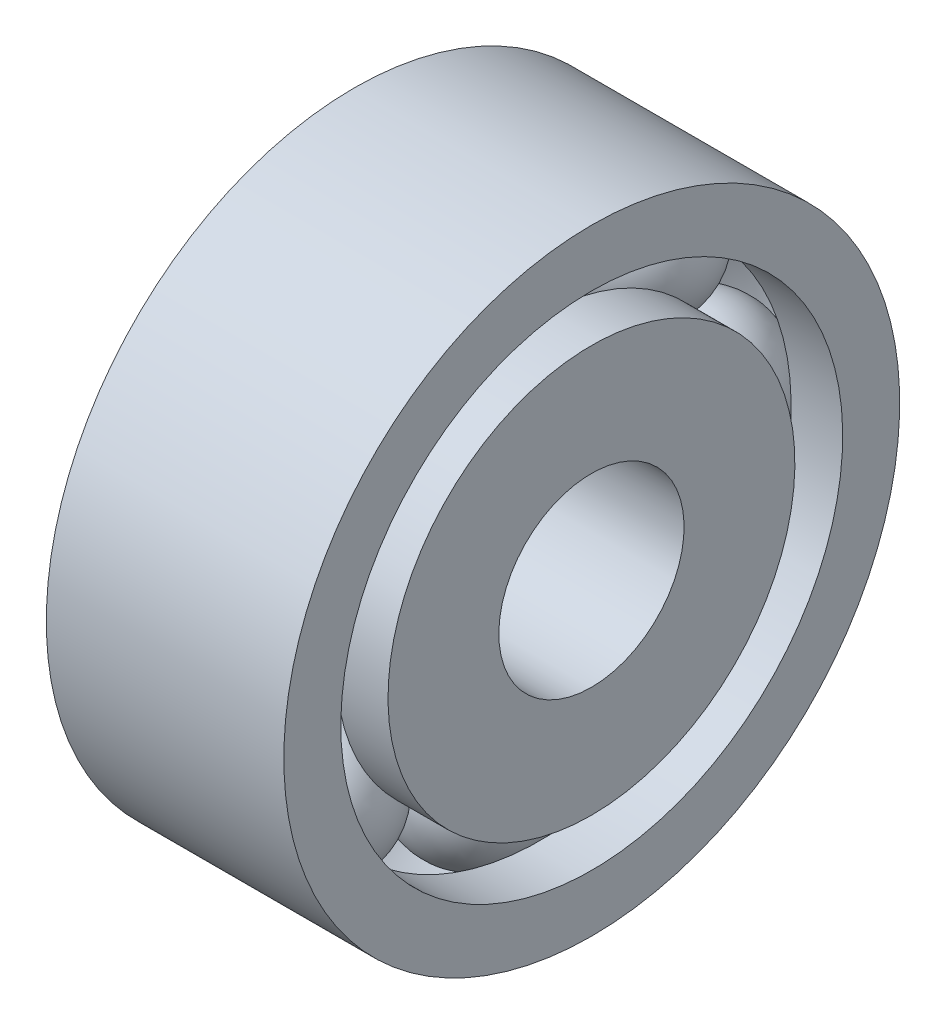
ISO-10303-21;
HEADER;
FILE_DESCRIPTION(('STEP AP214'),'2;1');
FILE_NAME('part.step','',(''),(''),'','','');
FILE_SCHEMA(('AUTOMOTIVE_DESIGN { 1 0 10303 214 1 1 1 1 }'));
ENDSEC;
DATA;
#1=APPLICATION_CONTEXT('core data for automotive mechanical design processes');
#2=APPLICATION_PROTOCOL_DEFINITION('international standard','automotive_design',2000,#1);
#3=PRODUCT_CONTEXT('',#1,'mechanical');
#4=PRODUCT('Part','Part','',(#3));
#5=PRODUCT_RELATED_PRODUCT_CATEGORY('part','',(#4));
#6=PRODUCT_DEFINITION_FORMATION('','',#4);
#7=PRODUCT_DEFINITION_CONTEXT('part definition',#1,'design');
#8=PRODUCT_DEFINITION('design','',#6,#7);
#9=PRODUCT_DEFINITION_SHAPE('','',#8);
#10=(LENGTH_UNIT() NAMED_UNIT(*) SI_UNIT(.MILLI.,.METRE.));
#11=(NAMED_UNIT(*) PLANE_ANGLE_UNIT() SI_UNIT($,.RADIAN.));
#12=(NAMED_UNIT(*) SI_UNIT($,.STERADIAN.) SOLID_ANGLE_UNIT());
#13=UNCERTAINTY_MEASURE_WITH_UNIT(LENGTH_MEASURE(1.E-05),#10,'distance_accuracy_value','');
#14=(GEOMETRIC_REPRESENTATION_CONTEXT(3) GLOBAL_UNCERTAINTY_ASSIGNED_CONTEXT((#13)) GLOBAL_UNIT_ASSIGNED_CONTEXT((#10,
#11,#12)) REPRESENTATION_CONTEXT('',''));
#15=CARTESIAN_POINT('',(0.,0.,0.));
#16=DIRECTION('',(0.,0.,1.));
#17=DIRECTION('',(1.,0.,0.));
#18=AXIS2_PLACEMENT_3D('',#15,#16,#17);
#19=CARTESIAN_POINT('',(0.,8.59029496479624,8.59029496479603));
#20=DIRECTION('',(0.,-0.707106781186556,-0.707106781186539));
#21=DIRECTION('',(-1.,0.,0.));
#22=AXIS2_PLACEMENT_3D('',#19,#20,#21);
#23=SPHERICAL_SURFACE('',#22,3.7465);
#24=CARTESIAN_POINT('',(0.,5.94111940908081,5.94111940908066));
#25=VERTEX_POINT('',#24);
#26=VERTEX_LOOP('',#25);
#27=FACE_BOUND('',#26,.T.);
#28=ADVANCED_FACE('F52',(#27),#23,.T.);
#29=CLOSED_SHELL('',(#28));
#30=MANIFOLD_SOLID_BREP('B2',#29);
#31=CARTESIAN_POINT('',(0.,1.27248905099234E-13,12.148511644));
#32=DIRECTION('',(0.,0.,-1.));
#33=DIRECTION('',(-1.,0.,0.));
#34=AXIS2_PLACEMENT_3D('',#31,#32,#33);
#35=SPHERICAL_SURFACE('',#34,3.7465);
#36=CARTESIAN_POINT('',(0.,0.,8.402011644));
#37=VERTEX_POINT('',#36);
#38=VERTEX_LOOP('',#37);
#39=FACE_BOUND('',#38,.T.);
#40=ADVANCED_FACE('F71',(#39),#35,.T.);
#41=CLOSED_SHELL('',(#40));
#42=MANIFOLD_SOLID_BREP('B6',#41);
#43=CARTESIAN_POINT('',(0.,-8.59029496479606,8.59029496479621));
#44=DIRECTION('',(0.,0.707106781186541,-0.707106781186554));
#45=DIRECTION('',(-1.,0.,0.));
#46=AXIS2_PLACEMENT_3D('',#43,#44,#45);
#47=SPHERICAL_SURFACE('',#46,3.7465);
#48=CARTESIAN_POINT('',(0.,-5.94111940908068,5.94111940908078));
#49=VERTEX_POINT('',#48);
#50=VERTEX_LOOP('',#49);
#51=FACE_BOUND('',#50,.T.);
#52=ADVANCED_FACE('F90',(#51),#47,.T.);
#53=CLOSED_SHELL('',(#52));
#54=MANIFOLD_SOLID_BREP('B48',#53);
#55=CARTESIAN_POINT('',(0.,-12.148511644,0.));
#56=DIRECTION('',(0.,1.,0.));
#57=DIRECTION('',(-1.,0.,0.));
#58=AXIS2_PLACEMENT_3D('',#55,#56,#57);
#59=SPHERICAL_SURFACE('',#58,3.7465);
#60=CARTESIAN_POINT('',(0.,-8.402011644,0.));
#61=VERTEX_POINT('',#60);
#62=VERTEX_LOOP('',#61);
#63=FACE_BOUND('',#62,.T.);
#64=ADVANCED_FACE('F109',(#63),#59,.T.);
#65=CLOSED_SHELL('',(#64));
#66=MANIFOLD_SOLID_BREP('B67',#65);
#67=CARTESIAN_POINT('',(0.,-8.59029496479618,-8.59029496479609));
#68=DIRECTION('',(0.,0.707106781186551,0.707106781186544));
#69=DIRECTION('',(-1.,0.,0.));
#70=AXIS2_PLACEMENT_3D('',#67,#68,#69);
#71=SPHERICAL_SURFACE('',#70,3.7465);
#72=CARTESIAN_POINT('',(0.,-5.94111940908076,-5.9411194090807));
#73=VERTEX_POINT('',#72);
#74=VERTEX_LOOP('',#73);
#75=FACE_BOUND('',#74,.T.);
#76=ADVANCED_FACE('F128',(#75),#71,.T.);
#77=CLOSED_SHELL('',(#76));
#78=MANIFOLD_SOLID_BREP('B86',#77);
#79=CARTESIAN_POINT('',(0.,0.,-12.148511644));
#80=DIRECTION('',(0.,0.,1.));
#81=DIRECTION('',(-1.,0.,0.));
#82=AXIS2_PLACEMENT_3D('',#79,#80,#81);
#83=SPHERICAL_SURFACE('',#82,3.7465);
#84=CARTESIAN_POINT('',(0.,0.,-8.402011644));
#85=VERTEX_POINT('',#84);
#86=VERTEX_LOOP('',#85);
#87=FACE_BOUND('',#86,.T.);
#88=ADVANCED_FACE('F147',(#87),#83,.T.);
#89=CLOSED_SHELL('',(#88));
#90=MANIFOLD_SOLID_BREP('B105',#89);
#91=CARTESIAN_POINT('',(0.,8.59029496479612,-8.59029496479615));
#92=DIRECTION('',(0.,-0.707106781186546,0.707106781186549));
#93=DIRECTION('',(-1.,0.,0.));
#94=AXIS2_PLACEMENT_3D('',#91,#92,#93);
#95=SPHERICAL_SURFACE('',#94,3.7465);
#96=CARTESIAN_POINT('',(0.,5.94111940908072,-5.94111940908074));
#97=VERTEX_POINT('',#96);
#98=VERTEX_LOOP('',#97);
#99=FACE_BOUND('',#98,.T.);
#100=ADVANCED_FACE('F166',(#99),#95,.T.);
#101=CLOSED_SHELL('',(#100));
#102=MANIFOLD_SOLID_BREP('B124',#101);
#103=CARTESIAN_POINT('',(0.,12.148511644,0.));
#104=DIRECTION('',(0.,-1.,0.));
#105=DIRECTION('',(-1.,0.,0.));
#106=AXIS2_PLACEMENT_3D('',#103,#104,#105);
#107=SPHERICAL_SURFACE('',#106,3.7465);
#108=CARTESIAN_POINT('',(0.,8.402011644,0.));
#109=VERTEX_POINT('',#108);
#110=VERTEX_LOOP('',#109);
#111=FACE_BOUND('',#110,.T.);
#112=ADVANCED_FACE('F187',(#111),#107,.T.);
#113=CLOSED_SHELL('',(#112));
#114=MANIFOLD_SOLID_BREP('B143',#113);
#115=CARTESIAN_POINT('',(0.,0.,0.));
#116=DIRECTION('',(-1.,0.,0.));
#117=DIRECTION('',(0.,-1.,0.));
#118=AXIS2_PLACEMENT_3D('',#115,#116,#117);
#119=TOROIDAL_SURFACE('',#118,12.148511644,3.81);
#120=CARTESIAN_POINT('',(3.59210244842766,0.,0.));
#121=DIRECTION('',(-1.,0.,0.));
#122=DIRECTION('',(0.,-1.,0.));
#123=AXIS2_PLACEMENT_3D('',#120,#121,#122);
#124=CIRCLE('',#123,10.878511644);
#125=CARTESIAN_POINT('',(3.59210244842767,-10.878511644,0.));
#126=VERTEX_POINT('',#125);
#127=EDGE_CURVE('E234',#126,#126,#124,.T.);
#128=ORIENTED_EDGE('',*,*,#127,.T.);
#129=EDGE_LOOP('',(#128));
#130=FACE_BOUND('',#129,.T.);
#131=CARTESIAN_POINT('',(-3.59210244842766,0.,0.));
#132=DIRECTION('',(-1.,0.,0.));
#133=DIRECTION('',(0.,-1.,0.));
#134=AXIS2_PLACEMENT_3D('',#131,#132,#133);
#135=CIRCLE('',#134,10.878511644);
#136=CARTESIAN_POINT('',(-3.59210244842765,-10.878511644,0.));
#137=VERTEX_POINT('',#136);
#138=EDGE_CURVE('E186',#137,#137,#135,.T.);
#139=ORIENTED_EDGE('',*,*,#138,.F.);
#140=EDGE_LOOP('',(#139));
#141=FACE_BOUND('',#140,.T.);
#142=ADVANCED_FACE('F207',(#130,#141),#119,.F.);
#143=CARTESIAN_POINT('',(6.35,0.,0.));
#144=DIRECTION('',(-1.,0.,0.));
#145=DIRECTION('',(0.,-1.,0.));
#146=AXIS2_PLACEMENT_3D('',#143,#144,#145);
#147=CYLINDRICAL_SURFACE('',#146,10.878511644);
#148=ORIENTED_EDGE('',*,*,#138,.T.);
#149=EDGE_LOOP('',(#148));
#150=FACE_BOUND('',#149,.T.);
#151=CARTESIAN_POINT('',(-6.35,0.,0.));
#152=DIRECTION('',(-1.,0.,0.));
#153=DIRECTION('',(0.,-1.,0.));
#154=AXIS2_PLACEMENT_3D('',#151,#152,#153);
#155=CIRCLE('',#154,10.878511644);
#156=CARTESIAN_POINT('',(-6.34999999999999,-10.878511644,0.));
#157=VERTEX_POINT('',#156);
#158=EDGE_CURVE('E214',#157,#157,#155,.T.);
#159=ORIENTED_EDGE('',*,*,#158,.F.);
#160=EDGE_LOOP('',(#159));
#161=FACE_BOUND('',#160,.T.);
#162=ADVANCED_FACE('F246',(#150,#161),#147,.T.);
#163=CARTESIAN_POINT('',(-6.35,0.,0.));
#164=DIRECTION('',(-1.,0.,0.));
#165=DIRECTION('',(0.,-1.,0.));
#166=AXIS2_PLACEMENT_3D('',#163,#164,#165);
#167=PLANE('',#166);
#168=ORIENTED_EDGE('',*,*,#158,.T.);
#169=EDGE_LOOP('',(#168));
#170=FACE_BOUND('',#169,.T.);
#171=CARTESIAN_POINT('',(-6.35,0.,0.));
#172=DIRECTION('',(-1.,0.,0.));
#173=DIRECTION('',(0.,-1.,0.));
#174=AXIS2_PLACEMENT_3D('',#171,#172,#173);
#175=CIRCLE('',#174,4.953);
#176=CARTESIAN_POINT('',(-6.35,-4.953,0.));
#177=VERTEX_POINT('',#176);
#178=EDGE_CURVE('E219',#177,#177,#175,.T.);
#179=ORIENTED_EDGE('',*,*,#178,.F.);
#180=EDGE_LOOP('',(#179));
#181=FACE_BOUND('',#180,.T.);
#182=ADVANCED_FACE('F254',(#170,#181),#167,.T.);
#183=CARTESIAN_POINT('',(6.35,0.,0.));
#184=DIRECTION('',(-1.,0.,0.));
#185=DIRECTION('',(0.,-1.,0.));
#186=AXIS2_PLACEMENT_3D('',#183,#184,#185);
#187=CYLINDRICAL_SURFACE('',#186,4.953);
#188=CARTESIAN_POINT('',(6.35,0.,0.));
#189=DIRECTION('',(-1.,0.,0.));
#190=DIRECTION('',(0.,-1.,0.));
#191=AXIS2_PLACEMENT_3D('',#188,#189,#190);
#192=CIRCLE('',#191,4.953);
#193=CARTESIAN_POINT('',(6.35,-4.95299999999999,0.));
#194=VERTEX_POINT('',#193);
#195=EDGE_CURVE('E224',#194,#194,#192,.T.);
#196=ORIENTED_EDGE('',*,*,#195,.F.);
#197=EDGE_LOOP('',(#196));
#198=FACE_BOUND('',#197,.T.);
#199=ORIENTED_EDGE('',*,*,#178,.T.);
#200=EDGE_LOOP('',(#199));
#201=FACE_BOUND('',#200,.T.);
#202=ADVANCED_FACE('F250',(#198,#201),#187,.F.);
#203=CARTESIAN_POINT('',(6.35,0.,0.));
#204=DIRECTION('',(1.,0.,0.));
#205=DIRECTION('',(0.,1.,0.));
#206=AXIS2_PLACEMENT_3D('',#203,#204,#205);
#207=PLANE('',#206);
#208=ORIENTED_EDGE('',*,*,#195,.T.);
#209=EDGE_LOOP('',(#208));
#210=FACE_BOUND('',#209,.T.);
#211=CARTESIAN_POINT('',(6.35,0.,0.));
#212=DIRECTION('',(-1.,0.,0.));
#213=DIRECTION('',(0.,-1.,0.));
#214=AXIS2_PLACEMENT_3D('',#211,#212,#213);
#215=CIRCLE('',#214,10.878511644);
#216=CARTESIAN_POINT('',(6.35000000000001,-10.878511644,0.));
#217=VERTEX_POINT('',#216);
#218=EDGE_CURVE('E230',#217,#217,#215,.T.);
#219=ORIENTED_EDGE('',*,*,#218,.F.);
#220=EDGE_LOOP('',(#219));
#221=FACE_BOUND('',#220,.T.);
#222=ADVANCED_FACE('F243',(#210,#221),#207,.T.);
#223=ORIENTED_EDGE('',*,*,#218,.T.);
#224=EDGE_LOOP('',(#223));
#225=FACE_BOUND('',#224,.T.);
#226=ORIENTED_EDGE('',*,*,#127,.F.);
#227=EDGE_LOOP('',(#226));
#228=FACE_BOUND('',#227,.T.);
#229=ADVANCED_FACE('F241',(#225,#228),#147,.T.);
#230=CLOSED_SHELL('',(#142,#162,#182,#202,#222,#229));
#231=MANIFOLD_SOLID_BREP('B162',#230);
#232=CARTESIAN_POINT('',(0.0162412053396235,0.,0.));
#233=DIRECTION('',(1.,0.,0.));
#234=DIRECTION('',(0.,1.,0.));
#235=AXIS2_PLACEMENT_3D('',#232,#233,#234);
#236=TOROIDAL_SURFACE('',#235,12.1485117507252,3.81);
#237=CARTESIAN_POINT('',(-3.57586124308804,0.,0.));
#238=DIRECTION('',(1.,0.,0.));
#239=DIRECTION('',(0.,1.,0.));
#240=AXIS2_PLACEMENT_3D('',#237,#238,#239);
#241=CIRCLE('',#240,13.4185117507252);
#242=CARTESIAN_POINT('',(-3.57586124308804,13.4185117507252,0.));
#243=VERTEX_POINT('',#242);
#244=EDGE_CURVE('E332',#243,#243,#241,.T.);
#245=ORIENTED_EDGE('',*,*,#244,.F.);
#246=EDGE_LOOP('',(#245));
#247=FACE_BOUND('',#246,.T.);
#248=CARTESIAN_POINT('',(3.60834365376729,0.,0.));
#249=DIRECTION('',(1.,0.,0.));
#250=DIRECTION('',(0.,1.,0.));
#251=AXIS2_PLACEMENT_3D('',#248,#249,#250);
#252=CIRCLE('',#251,13.4185117507252);
#253=CARTESIAN_POINT('',(3.60834365376729,13.4185117507252,0.));
#254=VERTEX_POINT('',#253);
#255=EDGE_CURVE('E206',#254,#254,#252,.T.);
#256=ORIENTED_EDGE('',*,*,#255,.T.);
#257=EDGE_LOOP('',(#256));
#258=FACE_BOUND('',#257,.T.);
#259=ADVANCED_FACE('F310',(#247,#258),#236,.F.);
#260=CARTESIAN_POINT('',(-6.33375879466038,0.,0.));
#261=DIRECTION('',(1.,0.,0.));
#262=DIRECTION('',(0.,1.,0.));
#263=AXIS2_PLACEMENT_3D('',#260,#261,#262);
#264=CYLINDRICAL_SURFACE('',#263,13.4185117507252);
#265=CARTESIAN_POINT('',(6.36624120533962,0.,0.));
#266=DIRECTION('',(1.,0.,0.));
#267=DIRECTION('',(0.,1.,0.));
#268=AXIS2_PLACEMENT_3D('',#265,#266,#267);
#269=CIRCLE('',#268,13.4185117507252);
#270=CARTESIAN_POINT('',(6.36624120533962,13.4185117507252,0.));
#271=VERTEX_POINT('',#270);
#272=EDGE_CURVE('E316',#271,#271,#269,.T.);
#273=ORIENTED_EDGE('',*,*,#272,.T.);
#274=EDGE_LOOP('',(#273));
#275=FACE_BOUND('',#274,.T.);
#276=ORIENTED_EDGE('',*,*,#255,.F.);
#277=EDGE_LOOP('',(#276));
#278=FACE_BOUND('',#277,.T.);
#279=ADVANCED_FACE('F340',(#275,#278),#264,.F.);
#280=CARTESIAN_POINT('',(6.36624120533962,0.,0.));
#281=DIRECTION('',(-1.,0.,0.));
#282=DIRECTION('',(0.,-1.,0.));
#283=AXIS2_PLACEMENT_3D('',#280,#281,#282);
#284=PLANE('',#283);
#285=ORIENTED_EDGE('',*,*,#272,.F.);
#286=EDGE_LOOP('',(#285));
#287=FACE_BOUND('',#286,.T.);
#288=CARTESIAN_POINT('',(6.36624120533962,0.,0.));
#289=DIRECTION('',(1.,0.,0.));
#290=DIRECTION('',(0.,1.,0.));
#291=AXIS2_PLACEMENT_3D('',#288,#289,#290);
#292=CIRCLE('',#291,16.4665117507252);
#293=CARTESIAN_POINT('',(6.36624120533962,16.4665117507252,0.));
#294=VERTEX_POINT('',#293);
#295=EDGE_CURVE('E320',#294,#294,#292,.T.);
#296=ORIENTED_EDGE('',*,*,#295,.T.);
#297=EDGE_LOOP('',(#296));
#298=FACE_BOUND('',#297,.T.);
#299=ADVANCED_FACE('F344',(#287,#298),#284,.F.);
#300=CARTESIAN_POINT('',(-6.33375879466038,0.,0.));
#301=DIRECTION('',(1.,0.,0.));
#302=DIRECTION('',(0.,1.,0.));
#303=AXIS2_PLACEMENT_3D('',#300,#301,#302);
#304=CYLINDRICAL_SURFACE('',#303,16.4665117507252);
#305=ORIENTED_EDGE('',*,*,#295,.F.);
#306=EDGE_LOOP('',(#305));
#307=FACE_BOUND('',#306,.T.);
#308=CARTESIAN_POINT('',(-6.33375879466038,0.,0.));
#309=DIRECTION('',(1.,0.,0.));
#310=DIRECTION('',(0.,1.,0.));
#311=AXIS2_PLACEMENT_3D('',#308,#309,#310);
#312=CIRCLE('',#311,16.4665117507252);
#313=CARTESIAN_POINT('',(-6.33375879466038,16.4665117507252,0.));
#314=VERTEX_POINT('',#313);
#315=EDGE_CURVE('E324',#314,#314,#312,.T.);
#316=ORIENTED_EDGE('',*,*,#315,.T.);
#317=EDGE_LOOP('',(#316));
#318=FACE_BOUND('',#317,.T.);
#319=ADVANCED_FACE('F349',(#307,#318),#304,.T.);
#320=CARTESIAN_POINT('',(-6.33375879466038,0.,0.));
#321=DIRECTION('',(1.,0.,0.));
#322=DIRECTION('',(0.,1.,0.));
#323=AXIS2_PLACEMENT_3D('',#320,#321,#322);
#324=PLANE('',#323);
#325=ORIENTED_EDGE('',*,*,#315,.F.);
#326=EDGE_LOOP('',(#325));
#327=FACE_BOUND('',#326,.T.);
#328=CARTESIAN_POINT('',(-6.33375879466038,0.,0.));
#329=DIRECTION('',(1.,0.,0.));
#330=DIRECTION('',(0.,1.,0.));
#331=AXIS2_PLACEMENT_3D('',#328,#329,#330);
#332=CIRCLE('',#331,13.4185117507252);
#333=CARTESIAN_POINT('',(-6.33375879466038,13.4185117507252,0.));
#334=VERTEX_POINT('',#333);
#335=EDGE_CURVE('E329',#334,#334,#332,.T.);
#336=ORIENTED_EDGE('',*,*,#335,.T.);
#337=EDGE_LOOP('',(#336));
#338=FACE_BOUND('',#337,.T.);
#339=ADVANCED_FACE('F354',(#327,#338),#324,.F.);
#340=ORIENTED_EDGE('',*,*,#244,.T.);
#341=EDGE_LOOP('',(#340));
#342=FACE_BOUND('',#341,.T.);
#343=ORIENTED_EDGE('',*,*,#335,.F.);
#344=EDGE_LOOP('',(#343));
#345=FACE_BOUND('',#344,.T.);
#346=ADVANCED_FACE('F336',(#342,#345),#264,.F.);
#347=CLOSED_SHELL('',(#259,#279,#299,#319,#339,#346));
#348=MANIFOLD_SOLID_BREP('B181',#347);
#349=ADVANCED_BREP_SHAPE_REPRESENTATION('',(#18,#30,#42,#54,#66,#78,#90,#102,#114,#231,#348),#14);
#350=SHAPE_DEFINITION_REPRESENTATION(#9,#349);
ENDSEC;
END-ISO-10303-21;
